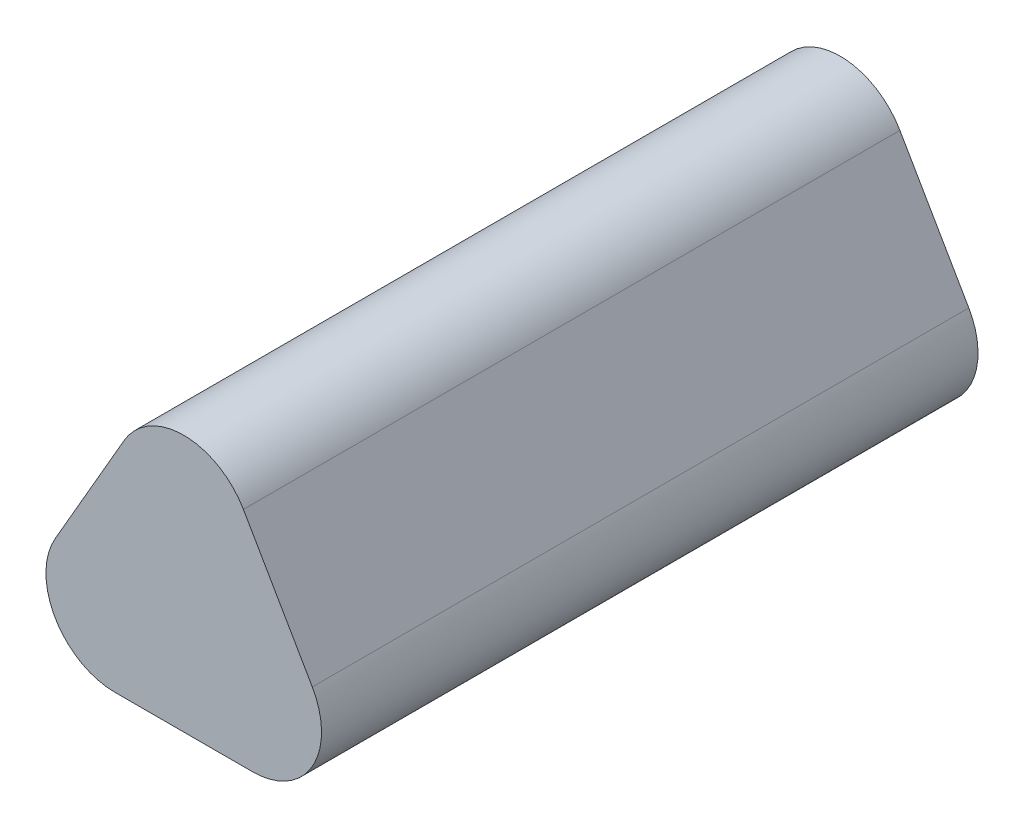
ISO-10303-21;
HEADER;
FILE_DESCRIPTION(('STEP AP214'),'2;1');
FILE_NAME('part.step','',(''),(''),'','','');
FILE_SCHEMA(('AUTOMOTIVE_DESIGN { 1 0 10303 214 1 1 1 1 }'));
ENDSEC;
DATA;
#1=APPLICATION_CONTEXT('core data for automotive mechanical design processes');
#2=APPLICATION_PROTOCOL_DEFINITION('international standard','automotive_design',2000,#1);
#3=PRODUCT_CONTEXT('',#1,'mechanical');
#4=PRODUCT('Part','Part','',(#3));
#5=PRODUCT_RELATED_PRODUCT_CATEGORY('part','',(#4));
#6=PRODUCT_DEFINITION_FORMATION('','',#4);
#7=PRODUCT_DEFINITION_CONTEXT('part definition',#1,'design');
#8=PRODUCT_DEFINITION('design','',#6,#7);
#9=PRODUCT_DEFINITION_SHAPE('','',#8);
#10=(LENGTH_UNIT() NAMED_UNIT(*) SI_UNIT(.MILLI.,.METRE.));
#11=(NAMED_UNIT(*) PLANE_ANGLE_UNIT() SI_UNIT($,.RADIAN.));
#12=(NAMED_UNIT(*) SI_UNIT($,.STERADIAN.) SOLID_ANGLE_UNIT());
#13=UNCERTAINTY_MEASURE_WITH_UNIT(LENGTH_MEASURE(1.E-05),#10,'distance_accuracy_value','');
#14=(GEOMETRIC_REPRESENTATION_CONTEXT(3) GLOBAL_UNCERTAINTY_ASSIGNED_CONTEXT((#13)) GLOBAL_UNIT_ASSIGNED_CONTEXT((#10,
#11,#12)) REPRESENTATION_CONTEXT('',''));
#15=CARTESIAN_POINT('',(0.,0.,0.));
#16=DIRECTION('',(0.,0.,1.));
#17=DIRECTION('',(1.,0.,0.));
#18=AXIS2_PLACEMENT_3D('',#15,#16,#17);
#19=CARTESIAN_POINT('',(0.,0.,75.));
#20=DIRECTION('',(0.,0.,-1.));
#21=DIRECTION('',(-1.,0.,0.));
#22=AXIS2_PLACEMENT_3D('',#19,#20,#21);
#23=CYLINDRICAL_SURFACE('',#22,7.87);
#24=CARTESIAN_POINT('',(0.,0.,0.));
#25=DIRECTION('',(0.,0.,1.));
#26=DIRECTION('',(1.,0.,0.));
#27=AXIS2_PLACEMENT_3D('',#24,#25,#26);
#28=CIRCLE('',#27,7.87);
#29=CARTESIAN_POINT('',(6.81561992778353,3.935,0.));
#30=VERTEX_POINT('',#29);
#31=CARTESIAN_POINT('',(-6.81561992778353,3.935,0.));
#32=VERTEX_POINT('',#31);
#33=EDGE_CURVE('E124',#30,#32,#28,.T.);
#34=ORIENTED_EDGE('',*,*,#33,.T.);
#35=DIRECTION('',(0.,0.,-1.));
#36=VECTOR('',#35,1.);
#37=CARTESIAN_POINT('',(-6.81561992778353,3.935,75.));
#38=LINE('',#37,#36);
#39=CARTESIAN_POINT('',(-6.81561992778353,3.935,75.));
#40=VERTEX_POINT('',#39);
#41=EDGE_CURVE('E11',#40,#32,#38,.T.);
#42=ORIENTED_EDGE('',*,*,#41,.F.);
#43=CARTESIAN_POINT('',(0.,0.,75.));
#44=DIRECTION('',(0.,0.,1.));
#45=DIRECTION('',(1.,0.,0.));
#46=AXIS2_PLACEMENT_3D('',#43,#44,#45);
#47=CIRCLE('',#46,7.87);
#48=CARTESIAN_POINT('',(6.81561992778353,3.935,75.));
#49=VERTEX_POINT('',#48);
#50=EDGE_CURVE('E134',#49,#40,#47,.T.);
#51=ORIENTED_EDGE('',*,*,#50,.F.);
#52=DIRECTION('',(0.,0.,-1.));
#53=VECTOR('',#52,1.);
#54=CARTESIAN_POINT('',(6.81561992778353,3.935,75.));
#55=LINE('',#54,#53);
#56=EDGE_CURVE('E120',#49,#30,#55,.T.);
#57=ORIENTED_EDGE('',*,*,#56,.T.);
#58=EDGE_LOOP('',(#34,#42,#51,#57));
#59=FACE_BOUND('',#58,.T.);
#60=ADVANCED_FACE('F40',(#59),#23,.T.);
#61=CARTESIAN_POINT('',(-6.81561992778353,3.935,75.));
#62=DIRECTION('',(0.866025403784439,-0.5,0.));
#63=DIRECTION('',(0.5,0.866025403784439,0.));
#64=AXIS2_PLACEMENT_3D('',#61,#62,#63);
#65=PLANE('',#64);
#66=DIRECTION('',(-0.5,-0.866025403784439,0.));
#67=VECTOR('',#66,1.);
#68=CARTESIAN_POINT('',(-6.81561992778353,3.935,0.));
#69=LINE('',#68,#67);
#70=CARTESIAN_POINT('',(-14.6856199277835,-9.69623985556707,0.));
#71=VERTEX_POINT('',#70);
#72=EDGE_CURVE('E127',#32,#71,#69,.T.);
#73=ORIENTED_EDGE('',*,*,#72,.T.);
#74=DIRECTION('',(0.,0.,-1.));
#75=VECTOR('',#74,1.);
#76=CARTESIAN_POINT('',(-14.6856199277835,-9.69623985556707,75.));
#77=LINE('',#76,#75);
#78=CARTESIAN_POINT('',(-14.6856199277835,-9.69623985556707,75.));
#79=VERTEX_POINT('',#78);
#80=EDGE_CURVE('E48',#79,#71,#77,.T.);
#81=ORIENTED_EDGE('',*,*,#80,.F.);
#82=DIRECTION('',(-0.5,-0.866025403784439,0.));
#83=VECTOR('',#82,1.);
#84=CARTESIAN_POINT('',(-6.81561992778353,3.935,75.));
#85=LINE('',#84,#83);
#86=EDGE_CURVE('E93',#40,#79,#85,.T.);
#87=ORIENTED_EDGE('',*,*,#86,.F.);
#88=ORIENTED_EDGE('',*,*,#41,.T.);
#89=EDGE_LOOP('',(#73,#81,#87,#88));
#90=FACE_BOUND('',#89,.T.);
#91=ADVANCED_FACE('F158',(#90),#65,.F.);
#92=CARTESIAN_POINT('',(-7.87,-13.6312398555671,75.));
#93=DIRECTION('',(0.,0.,-1.));
#94=DIRECTION('',(-1.,0.,0.));
#95=AXIS2_PLACEMENT_3D('',#92,#93,#94);
#96=CYLINDRICAL_SURFACE('',#95,7.87);
#97=CARTESIAN_POINT('',(-7.87,-13.6312398555671,0.));
#98=DIRECTION('',(0.,0.,1.));
#99=DIRECTION('',(1.,0.,0.));
#100=AXIS2_PLACEMENT_3D('',#97,#98,#99);
#101=CIRCLE('',#100,7.87);
#102=CARTESIAN_POINT('',(-7.87,-21.5012398555671,0.));
#103=VERTEX_POINT('',#102);
#104=EDGE_CURVE('E129',#71,#103,#101,.T.);
#105=ORIENTED_EDGE('',*,*,#104,.T.);
#106=DIRECTION('',(0.,0.,-1.));
#107=VECTOR('',#106,1.);
#108=CARTESIAN_POINT('',(-7.87,-21.5012398555671,75.));
#109=LINE('',#108,#107);
#110=CARTESIAN_POINT('',(-7.87,-21.5012398555671,75.));
#111=VERTEX_POINT('',#110);
#112=EDGE_CURVE('E115',#111,#103,#109,.T.);
#113=ORIENTED_EDGE('',*,*,#112,.F.);
#114=CARTESIAN_POINT('',(-7.87,-13.6312398555671,75.));
#115=DIRECTION('',(0.,0.,1.));
#116=DIRECTION('',(1.,0.,0.));
#117=AXIS2_PLACEMENT_3D('',#114,#115,#116);
#118=CIRCLE('',#117,7.87);
#119=EDGE_CURVE('E106',#79,#111,#118,.T.);
#120=ORIENTED_EDGE('',*,*,#119,.F.);
#121=ORIENTED_EDGE('',*,*,#80,.T.);
#122=EDGE_LOOP('',(#105,#113,#120,#121));
#123=FACE_BOUND('',#122,.T.);
#124=ADVANCED_FACE('F140',(#123),#96,.T.);
#125=CARTESIAN_POINT('',(-7.87,-21.5012398555671,75.));
#126=DIRECTION('',(0.,1.,0.));
#127=DIRECTION('',(0.,0.,1.));
#128=AXIS2_PLACEMENT_3D('',#125,#126,#127);
#129=PLANE('',#128);
#130=DIRECTION('',(1.,0.,0.));
#131=VECTOR('',#130,1.);
#132=CARTESIAN_POINT('',(-7.87,-21.5012398555671,0.));
#133=LINE('',#132,#131);
#134=CARTESIAN_POINT('',(7.87000000000008,-21.5012398555671,0.));
#135=VERTEX_POINT('',#134);
#136=EDGE_CURVE('E114',#103,#135,#133,.T.);
#137=ORIENTED_EDGE('',*,*,#136,.T.);
#138=DIRECTION('',(0.,0.,-1.));
#139=VECTOR('',#138,1.);
#140=CARTESIAN_POINT('',(7.87000000000008,-21.5012398555671,75.));
#141=LINE('',#140,#139);
#142=CARTESIAN_POINT('',(7.87000000000008,-21.5012398555671,75.));
#143=VERTEX_POINT('',#142);
#144=EDGE_CURVE('E111',#143,#135,#141,.T.);
#145=ORIENTED_EDGE('',*,*,#144,.F.);
#146=DIRECTION('',(1.,0.,0.));
#147=VECTOR('',#146,1.);
#148=CARTESIAN_POINT('',(-7.87,-21.5012398555671,75.));
#149=LINE('',#148,#147);
#150=EDGE_CURVE('E100',#111,#143,#149,.T.);
#151=ORIENTED_EDGE('',*,*,#150,.F.);
#152=ORIENTED_EDGE('',*,*,#112,.T.);
#153=EDGE_LOOP('',(#137,#145,#151,#152));
#154=FACE_BOUND('',#153,.T.);
#155=ADVANCED_FACE('F112',(#154),#129,.F.);
#156=CARTESIAN_POINT('',(7.87,-13.6312398555671,75.));
#157=DIRECTION('',(0.,0.,-1.));
#158=DIRECTION('',(-1.,0.,0.));
#159=AXIS2_PLACEMENT_3D('',#156,#157,#158);
#160=CYLINDRICAL_SURFACE('',#159,7.87);
#161=CARTESIAN_POINT('',(7.87,-13.6312398555671,0.));
#162=DIRECTION('',(0.,0.,1.));
#163=DIRECTION('',(1.,0.,0.));
#164=AXIS2_PLACEMENT_3D('',#161,#162,#163);
#165=CIRCLE('',#164,7.87);
#166=CARTESIAN_POINT('',(14.6856199277835,-9.69623985556707,0.));
#167=VERTEX_POINT('',#166);
#168=EDGE_CURVE('E79',#135,#167,#165,.T.);
#169=ORIENTED_EDGE('',*,*,#168,.T.);
#170=DIRECTION('',(0.,0.,-1.));
#171=VECTOR('',#170,1.);
#172=CARTESIAN_POINT('',(14.6856199277835,-9.69623985556707,75.));
#173=LINE('',#172,#171);
#174=CARTESIAN_POINT('',(14.6856199277835,-9.69623985556707,75.));
#175=VERTEX_POINT('',#174);
#176=EDGE_CURVE('E116',#175,#167,#173,.T.);
#177=ORIENTED_EDGE('',*,*,#176,.F.);
#178=CARTESIAN_POINT('',(7.87,-13.6312398555671,75.));
#179=DIRECTION('',(0.,0.,1.));
#180=DIRECTION('',(1.,0.,0.));
#181=AXIS2_PLACEMENT_3D('',#178,#179,#180);
#182=CIRCLE('',#181,7.87);
#183=EDGE_CURVE('E104',#143,#175,#182,.T.);
#184=ORIENTED_EDGE('',*,*,#183,.F.);
#185=ORIENTED_EDGE('',*,*,#144,.T.);
#186=EDGE_LOOP('',(#169,#177,#184,#185));
#187=FACE_BOUND('',#186,.T.);
#188=ADVANCED_FACE('F118',(#187),#160,.T.);
#189=CARTESIAN_POINT('',(6.81561992778353,3.935,75.));
#190=DIRECTION('',(-0.866025403784439,-0.5,0.));
#191=DIRECTION('',(0.5,-0.866025403784439,0.));
#192=AXIS2_PLACEMENT_3D('',#189,#190,#191);
#193=PLANE('',#192);
#194=DIRECTION('',(-0.5,0.866025403784439,0.));
#195=VECTOR('',#194,1.);
#196=CARTESIAN_POINT('',(6.81561992778353,3.935,0.));
#197=LINE('',#196,#195);
#198=EDGE_CURVE('E85',#167,#30,#197,.T.);
#199=ORIENTED_EDGE('',*,*,#198,.T.);
#200=ORIENTED_EDGE('',*,*,#56,.F.);
#201=DIRECTION('',(-0.5,0.866025403784439,0.));
#202=VECTOR('',#201,1.);
#203=CARTESIAN_POINT('',(6.81561992778353,3.935,75.));
#204=LINE('',#203,#202);
#205=EDGE_CURVE('E56',#175,#49,#204,.T.);
#206=ORIENTED_EDGE('',*,*,#205,.F.);
#207=ORIENTED_EDGE('',*,*,#176,.T.);
#208=EDGE_LOOP('',(#199,#200,#206,#207));
#209=FACE_BOUND('',#208,.T.);
#210=ADVANCED_FACE('F147',(#209),#193,.F.);
#211=CARTESIAN_POINT('',(0.,0.,75.));
#212=DIRECTION('',(0.,0.,1.));
#213=DIRECTION('',(1.,0.,0.));
#214=AXIS2_PLACEMENT_3D('',#211,#212,#213);
#215=PLANE('',#214);
#216=ORIENTED_EDGE('',*,*,#50,.T.);
#217=ORIENTED_EDGE('',*,*,#86,.T.);
#218=ORIENTED_EDGE('',*,*,#119,.T.);
#219=ORIENTED_EDGE('',*,*,#150,.T.);
#220=ORIENTED_EDGE('',*,*,#183,.T.);
#221=ORIENTED_EDGE('',*,*,#205,.T.);
#222=EDGE_LOOP('',(#216,#217,#218,#219,#220,#221));
#223=FACE_BOUND('',#222,.T.);
#224=ADVANCED_FACE('F102',(#223),#215,.T.);
#225=CARTESIAN_POINT('',(0.,0.,0.));
#226=DIRECTION('',(0.,0.,1.));
#227=DIRECTION('',(1.,0.,0.));
#228=AXIS2_PLACEMENT_3D('',#225,#226,#227);
#229=PLANE('',#228);
#230=ORIENTED_EDGE('',*,*,#33,.F.);
#231=ORIENTED_EDGE('',*,*,#198,.F.);
#232=ORIENTED_EDGE('',*,*,#168,.F.);
#233=ORIENTED_EDGE('',*,*,#136,.F.);
#234=ORIENTED_EDGE('',*,*,#104,.F.);
#235=ORIENTED_EDGE('',*,*,#72,.F.);
#236=EDGE_LOOP('',(#230,#231,#232,#233,#234,#235));
#237=FACE_BOUND('',#236,.T.);
#238=ADVANCED_FACE('F143',(#237),#229,.F.);
#239=CLOSED_SHELL('',(#60,#91,#124,#155,#188,#210,#224,#238));
#240=MANIFOLD_SOLID_BREP('B2',#239);
#241=ADVANCED_BREP_SHAPE_REPRESENTATION('',(#18,#240),#14);
#242=SHAPE_DEFINITION_REPRESENTATION(#9,#241);
ENDSEC;
END-ISO-10303-21;
